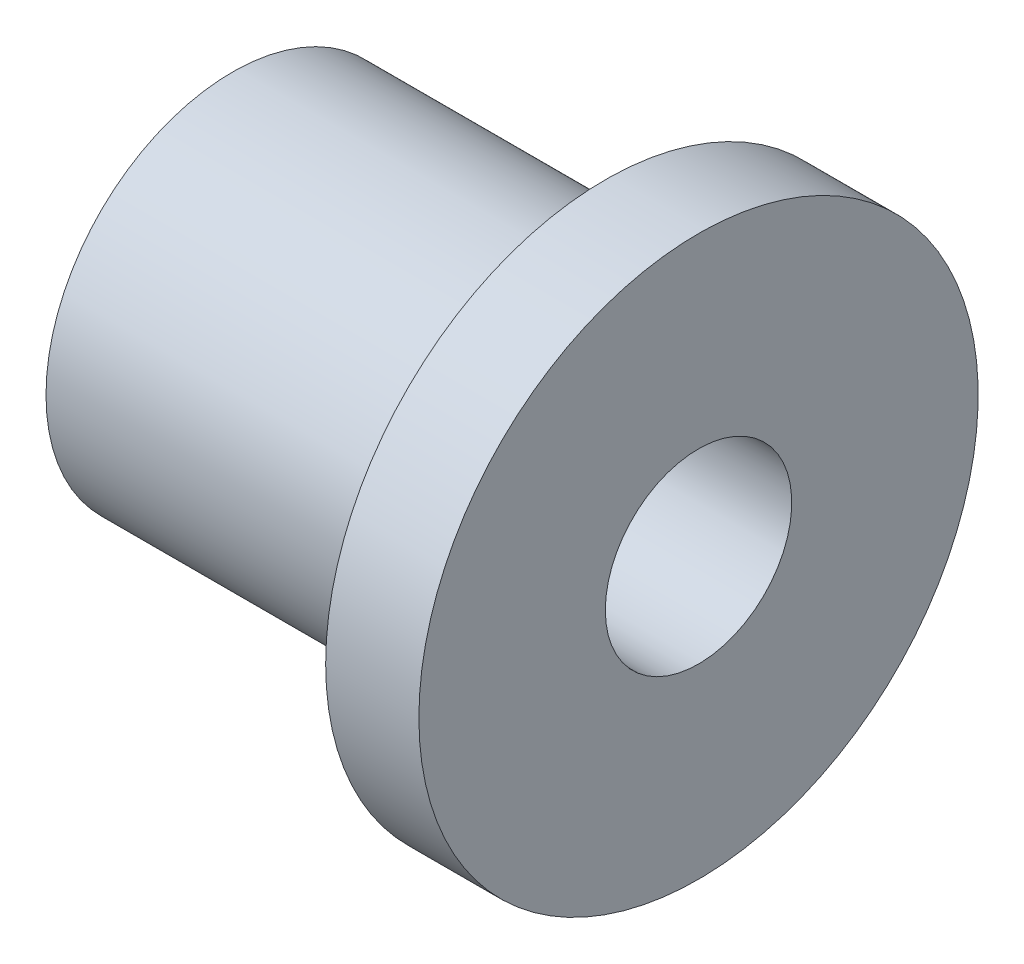
ISO-10303-21;
HEADER;
FILE_DESCRIPTION(('STEP AP214'),'2;1');
FILE_NAME('part.step','',(''),(''),'','','');
FILE_SCHEMA(('AUTOMOTIVE_DESIGN { 1 0 10303 214 1 1 1 1 }'));
ENDSEC;
DATA;
#1=APPLICATION_CONTEXT('core data for automotive mechanical design processes');
#2=APPLICATION_PROTOCOL_DEFINITION('international standard','automotive_design',2000,#1);
#3=PRODUCT_CONTEXT('',#1,'mechanical');
#4=PRODUCT('Part','Part','',(#3));
#5=PRODUCT_RELATED_PRODUCT_CATEGORY('part','',(#4));
#6=PRODUCT_DEFINITION_FORMATION('','',#4);
#7=PRODUCT_DEFINITION_CONTEXT('part definition',#1,'design');
#8=PRODUCT_DEFINITION('design','',#6,#7);
#9=PRODUCT_DEFINITION_SHAPE('','',#8);
#10=(LENGTH_UNIT() NAMED_UNIT(*) SI_UNIT(.MILLI.,.METRE.));
#11=(NAMED_UNIT(*) PLANE_ANGLE_UNIT() SI_UNIT($,.RADIAN.));
#12=(NAMED_UNIT(*) SI_UNIT($,.STERADIAN.) SOLID_ANGLE_UNIT());
#13=UNCERTAINTY_MEASURE_WITH_UNIT(LENGTH_MEASURE(1.E-05),#10,'distance_accuracy_value','');
#14=(GEOMETRIC_REPRESENTATION_CONTEXT(3) GLOBAL_UNCERTAINTY_ASSIGNED_CONTEXT((#13)) GLOBAL_UNIT_ASSIGNED_CONTEXT((#10,
#11,#12)) REPRESENTATION_CONTEXT('',''));
#15=CARTESIAN_POINT('',(0.,0.,0.));
#16=DIRECTION('',(0.,0.,1.));
#17=DIRECTION('',(1.,0.,0.));
#18=AXIS2_PLACEMENT_3D('',#15,#16,#17);
#19=CARTESIAN_POINT('',(0.,0.,0.));
#20=DIRECTION('',(-1.,0.,0.));
#21=DIRECTION('',(0.,0.,1.));
#22=AXIS2_PLACEMENT_3D('',#19,#20,#21);
#23=CYLINDRICAL_SURFACE('',#22,3.175);
#24=CARTESIAN_POINT('',(15.875,0.,0.));
#25=DIRECTION('',(-1.,0.,0.));
#26=DIRECTION('',(0.,0.,1.));
#27=AXIS2_PLACEMENT_3D('',#24,#25,#26);
#28=CIRCLE('',#27,3.175);
#29=CARTESIAN_POINT('',(15.875,0.,3.175));
#30=VERTEX_POINT('',#29);
#31=EDGE_CURVE('E54',#30,#30,#28,.T.);
#32=ORIENTED_EDGE('',*,*,#31,.F.);
#33=EDGE_LOOP('',(#32));
#34=FACE_BOUND('',#33,.T.);
#35=CARTESIAN_POINT('',(0.,0.,0.));
#36=DIRECTION('',(-1.,0.,0.));
#37=DIRECTION('',(0.,0.,1.));
#38=AXIS2_PLACEMENT_3D('',#35,#36,#37);
#39=CIRCLE('',#38,3.175);
#40=CARTESIAN_POINT('',(0.,0.,3.175));
#41=VERTEX_POINT('',#40);
#42=EDGE_CURVE('E10',#41,#41,#39,.T.);
#43=ORIENTED_EDGE('',*,*,#42,.T.);
#44=EDGE_LOOP('',(#43));
#45=FACE_BOUND('',#44,.T.);
#46=ADVANCED_FACE('F32',(#34,#45),#23,.F.);
#47=CARTESIAN_POINT('',(0.,3.175,0.));
#48=DIRECTION('',(1.,0.,0.));
#49=DIRECTION('',(0.,0.,-1.));
#50=AXIS2_PLACEMENT_3D('',#47,#48,#49);
#51=PLANE('',#50);
#52=ORIENTED_EDGE('',*,*,#42,.F.);
#53=EDGE_LOOP('',(#52));
#54=FACE_BOUND('',#53,.T.);
#55=CARTESIAN_POINT('',(0.,0.,0.));
#56=DIRECTION('',(-1.,0.,0.));
#57=DIRECTION('',(0.,0.,1.));
#58=AXIS2_PLACEMENT_3D('',#55,#56,#57);
#59=CIRCLE('',#58,6.35);
#60=CARTESIAN_POINT('',(0.,0.,6.35));
#61=VERTEX_POINT('',#60);
#62=EDGE_CURVE('E38',#61,#61,#59,.T.);
#63=ORIENTED_EDGE('',*,*,#62,.T.);
#64=EDGE_LOOP('',(#63));
#65=FACE_BOUND('',#64,.T.);
#66=ADVANCED_FACE('F61',(#54,#65),#51,.F.);
#67=CARTESIAN_POINT('',(0.,0.,0.));
#68=DIRECTION('',(-1.,0.,0.));
#69=DIRECTION('',(0.,0.,1.));
#70=AXIS2_PLACEMENT_3D('',#67,#68,#69);
#71=CYLINDRICAL_SURFACE('',#70,6.35);
#72=ORIENTED_EDGE('',*,*,#62,.F.);
#73=EDGE_LOOP('',(#72));
#74=FACE_BOUND('',#73,.T.);
#75=CARTESIAN_POINT('',(12.7,0.,0.));
#76=DIRECTION('',(-1.,0.,0.));
#77=DIRECTION('',(0.,0.,1.));
#78=AXIS2_PLACEMENT_3D('',#75,#76,#77);
#79=CIRCLE('',#78,6.35);
#80=CARTESIAN_POINT('',(12.7,0.,6.35));
#81=VERTEX_POINT('',#80);
#82=EDGE_CURVE('E42',#81,#81,#79,.T.);
#83=ORIENTED_EDGE('',*,*,#82,.T.);
#84=EDGE_LOOP('',(#83));
#85=FACE_BOUND('',#84,.T.);
#86=ADVANCED_FACE('F65',(#74,#85),#71,.T.);
#87=CARTESIAN_POINT('',(12.7,6.35,0.));
#88=DIRECTION('',(1.,0.,0.));
#89=DIRECTION('',(0.,0.,-1.));
#90=AXIS2_PLACEMENT_3D('',#87,#88,#89);
#91=PLANE('',#90);
#92=ORIENTED_EDGE('',*,*,#82,.F.);
#93=EDGE_LOOP('',(#92));
#94=FACE_BOUND('',#93,.T.);
#95=CARTESIAN_POINT('',(12.7,0.,0.));
#96=DIRECTION('',(-1.,0.,0.));
#97=DIRECTION('',(0.,0.,1.));
#98=AXIS2_PLACEMENT_3D('',#95,#96,#97);
#99=CIRCLE('',#98,9.525);
#100=CARTESIAN_POINT('',(12.7,0.,9.525));
#101=VERTEX_POINT('',#100);
#102=EDGE_CURVE('E46',#101,#101,#99,.T.);
#103=ORIENTED_EDGE('',*,*,#102,.T.);
#104=EDGE_LOOP('',(#103));
#105=FACE_BOUND('',#104,.T.);
#106=ADVANCED_FACE('F70',(#94,#105),#91,.F.);
#107=CARTESIAN_POINT('',(0.,0.,0.));
#108=DIRECTION('',(-1.,0.,0.));
#109=DIRECTION('',(0.,0.,1.));
#110=AXIS2_PLACEMENT_3D('',#107,#108,#109);
#111=CYLINDRICAL_SURFACE('',#110,9.525);
#112=ORIENTED_EDGE('',*,*,#102,.F.);
#113=EDGE_LOOP('',(#112));
#114=FACE_BOUND('',#113,.T.);
#115=CARTESIAN_POINT('',(15.875,0.,0.));
#116=DIRECTION('',(-1.,0.,0.));
#117=DIRECTION('',(0.,0.,1.));
#118=AXIS2_PLACEMENT_3D('',#115,#116,#117);
#119=CIRCLE('',#118,9.525);
#120=CARTESIAN_POINT('',(15.875,0.,9.525));
#121=VERTEX_POINT('',#120);
#122=EDGE_CURVE('E51',#121,#121,#119,.T.);
#123=ORIENTED_EDGE('',*,*,#122,.T.);
#124=EDGE_LOOP('',(#123));
#125=FACE_BOUND('',#124,.T.);
#126=ADVANCED_FACE('F76',(#114,#125),#111,.T.);
#127=CARTESIAN_POINT('',(15.875,9.525,0.));
#128=DIRECTION('',(-1.,0.,0.));
#129=DIRECTION('',(0.,0.,1.));
#130=AXIS2_PLACEMENT_3D('',#127,#128,#129);
#131=PLANE('',#130);
#132=ORIENTED_EDGE('',*,*,#122,.F.);
#133=EDGE_LOOP('',(#132));
#134=FACE_BOUND('',#133,.T.);
#135=ORIENTED_EDGE('',*,*,#31,.T.);
#136=EDGE_LOOP('',(#135));
#137=FACE_BOUND('',#136,.T.);
#138=ADVANCED_FACE('F58',(#134,#137),#131,.F.);
#139=CLOSED_SHELL('',(#46,#66,#86,#106,#126,#138));
#140=MANIFOLD_SOLID_BREP('B2',#139);
#141=ADVANCED_BREP_SHAPE_REPRESENTATION('',(#18,#140),#14);
#142=SHAPE_DEFINITION_REPRESENTATION(#9,#141);
ENDSEC;
END-ISO-10303-21;
